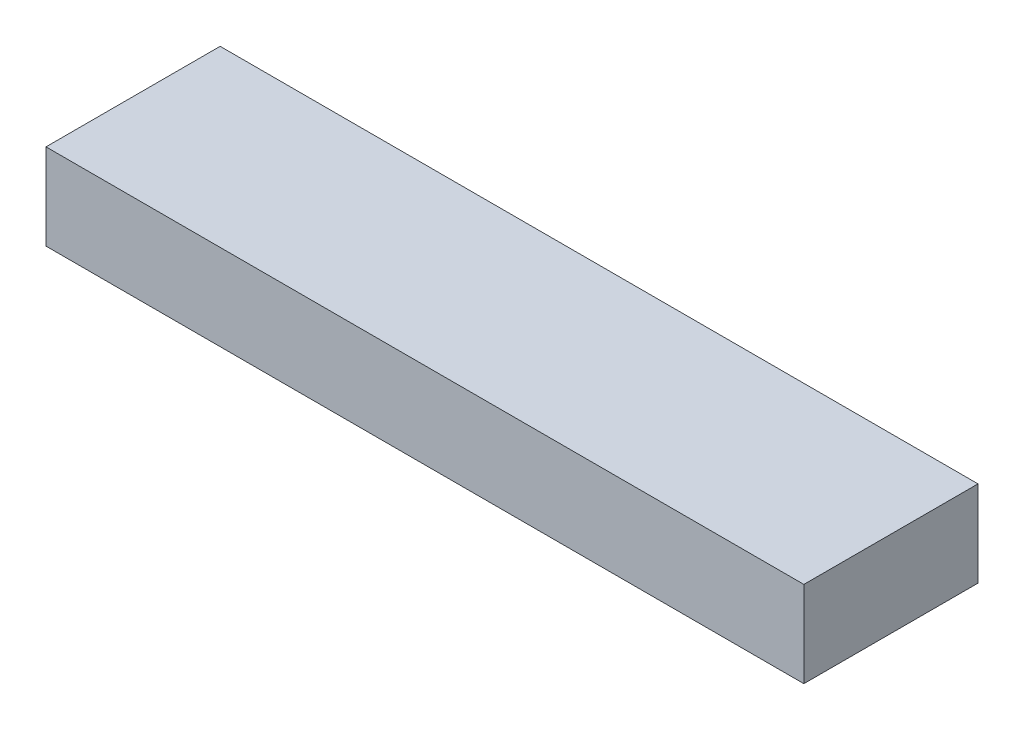
ISO-10303-21;
HEADER;
FILE_DESCRIPTION(('STEP AP214'),'2;1');
FILE_NAME('part.step','',(''),(''),'','','');
FILE_SCHEMA(('AUTOMOTIVE_DESIGN { 1 0 10303 214 1 1 1 1 }'));
ENDSEC;
DATA;
#1=APPLICATION_CONTEXT('core data for automotive mechanical design processes');
#2=APPLICATION_PROTOCOL_DEFINITION('international standard','automotive_design',2000,#1);
#3=PRODUCT_CONTEXT('',#1,'mechanical');
#4=PRODUCT('Part','Part','',(#3));
#5=PRODUCT_RELATED_PRODUCT_CATEGORY('part','',(#4));
#6=PRODUCT_DEFINITION_FORMATION('','',#4);
#7=PRODUCT_DEFINITION_CONTEXT('part definition',#1,'design');
#8=PRODUCT_DEFINITION('design','',#6,#7);
#9=PRODUCT_DEFINITION_SHAPE('','',#8);
#10=(LENGTH_UNIT() NAMED_UNIT(*) SI_UNIT(.MILLI.,.METRE.));
#11=(NAMED_UNIT(*) PLANE_ANGLE_UNIT() SI_UNIT($,.RADIAN.));
#12=(NAMED_UNIT(*) SI_UNIT($,.STERADIAN.) SOLID_ANGLE_UNIT());
#13=UNCERTAINTY_MEASURE_WITH_UNIT(LENGTH_MEASURE(1.E-05),#10,'distance_accuracy_value','');
#14=(GEOMETRIC_REPRESENTATION_CONTEXT(3) GLOBAL_UNCERTAINTY_ASSIGNED_CONTEXT((#13)) GLOBAL_UNIT_ASSIGNED_CONTEXT((#10,
#11,#12)) REPRESENTATION_CONTEXT('',''));
#15=CARTESIAN_POINT('',(0.,0.,0.));
#16=DIRECTION('',(0.,0.,1.));
#17=DIRECTION('',(1.,0.,0.));
#18=AXIS2_PLACEMENT_3D('',#15,#16,#17);
#19=CARTESIAN_POINT('',(0.,0.,0.));
#20=DIRECTION('',(0.,1.,0.));
#21=DIRECTION('',(0.,0.,1.));
#22=AXIS2_PLACEMENT_3D('',#19,#20,#21);
#23=PLANE('',#22);
#24=CARTESIAN_POINT('',(859.436709010091,6.51824651149789E-13,-93.3450000001667));
#25=DIRECTION('',(0.,-1.,0.));
#26=DIRECTION('',(0.,0.,-1.));
#27=AXIS2_PLACEMENT_3D('',#24,#25,#26);
#28=CIRCLE('',#27,3.17500000000008);
#29=CARTESIAN_POINT('',(859.436709010091,6.73995557651443E-13,-96.5200000001668));
#30=VERTEX_POINT('',#29);
#31=EDGE_CURVE('E371',#30,#30,#28,.T.);
#32=ORIENTED_EDGE('',*,*,#31,.F.);
#33=EDGE_LOOP('',(#32));
#34=FACE_BOUND('',#33,.T.);
#35=CARTESIAN_POINT('',(65.6867090100912,5.94180294244323E-13,-85.0899999999998));
#36=DIRECTION('',(0.,-1.,0.));
#37=DIRECTION('',(0.,0.,-1.));
#38=AXIS2_PLACEMENT_3D('',#35,#36,#37);
#39=CIRCLE('',#38,3.175);
#40=CARTESIAN_POINT('',(65.6867090100912,6.16351200745977E-13,-88.2649999999998));
#41=VERTEX_POINT('',#40);
#42=EDGE_CURVE('E363',#41,#41,#39,.T.);
#43=ORIENTED_EDGE('',*,*,#42,.F.);
#44=EDGE_LOOP('',(#43));
#45=FACE_BOUND('',#44,.T.);
#46=CARTESIAN_POINT('',(211.736709010091,4.32776094912283E-13,-61.9759999999998));
#47=DIRECTION('',(0.,-1.,0.));
#48=DIRECTION('',(0.,0.,-1.));
#49=AXIS2_PLACEMENT_3D('',#46,#47,#48);
#50=CIRCLE('',#49,3.17499999999997);
#51=CARTESIAN_POINT('',(211.736709010091,4.54947001413937E-13,-65.1509999999998));
#52=VERTEX_POINT('',#51);
#53=EDGE_CURVE('E356',#52,#52,#50,.T.);
#54=ORIENTED_EDGE('',*,*,#53,.F.);
#55=EDGE_LOOP('',(#54));
#56=FACE_BOUND('',#55,.T.);
#57=CARTESIAN_POINT('',(630.836709010091,6.51824651148623E-13,-93.3449999999998));
#58=DIRECTION('',(0.,-1.,0.));
#59=DIRECTION('',(0.,0.,-1.));
#60=AXIS2_PLACEMENT_3D('',#57,#58,#59);
#61=CIRCLE('',#60,3.17499999999997);
#62=CARTESIAN_POINT('',(630.836709010091,6.73995557650277E-13,-96.5199999999998));
#63=VERTEX_POINT('',#62);
#64=EDGE_CURVE('E249',#63,#63,#61,.T.);
#65=ORIENTED_EDGE('',*,*,#64,.F.);
#66=EDGE_LOOP('',(#65));
#67=FACE_BOUND('',#66,.T.);
#68=CARTESIAN_POINT('',(402.236709010091,5.94180294244323E-13,-85.0899999999998));
#69=DIRECTION('',(0.,-1.,0.));
#70=DIRECTION('',(0.,0.,-1.));
#71=AXIS2_PLACEMENT_3D('',#68,#69,#70);
#72=CIRCLE('',#71,3.17499999999997);
#73=CARTESIAN_POINT('',(402.236709010091,6.16351200745977E-13,-88.2649999999998));
#74=VERTEX_POINT('',#73);
#75=EDGE_CURVE('E248',#74,#74,#72,.T.);
#76=ORIENTED_EDGE('',*,*,#75,.F.);
#77=EDGE_LOOP('',(#76));
#78=FACE_BOUND('',#77,.T.);
#79=CARTESIAN_POINT('',(65.6867090100912,2.48314152818522E-13,-35.5599999999998));
#80=DIRECTION('',(0.,-1.,0.));
#81=DIRECTION('',(0.,0.,-1.));
#82=AXIS2_PLACEMENT_3D('',#79,#80,#81);
#83=CIRCLE('',#82,3.175);
#84=CARTESIAN_POINT('',(65.6867090100912,2.70485059320176E-13,-38.7349999999998));
#85=VERTEX_POINT('',#84);
#86=EDGE_CURVE('E338',#85,#85,#83,.T.);
#87=ORIENTED_EDGE('',*,*,#86,.F.);
#88=EDGE_LOOP('',(#87));
#89=FACE_BOUND('',#88,.T.);
#90=DIRECTION('',(0.,0.,1.));
#91=VECTOR('',#90,1.);
#92=CARTESIAN_POINT('',(21.2367090100912,7.18337370653585E-13,-102.87));
#93=LINE('',#92,#91);
#94=CARTESIAN_POINT('',(21.2367090100912,7.18337370653585E-13,-102.87));
#95=VERTEX_POINT('',#94);
#96=CARTESIAN_POINT('',(21.2367090100912,-7.18337370653585E-13,102.87));
#97=VERTEX_POINT('',#96);
#98=EDGE_CURVE('E168',#95,#97,#93,.T.);
#99=ORIENTED_EDGE('',*,*,#98,.F.);
#100=DIRECTION('',(-1.,0.,0.));
#101=VECTOR('',#100,1.);
#102=CARTESIAN_POINT('',(21.2367090100912,7.18337370653585E-13,-102.87));
#103=LINE('',#102,#101);
#104=CARTESIAN_POINT('',(916.641442589869,7.18337370653585E-13,-102.87));
#105=VERTEX_POINT('',#104);
#106=EDGE_CURVE('E174',#105,#95,#103,.T.);
#107=ORIENTED_EDGE('',*,*,#106,.F.);
#108=DIRECTION('',(0.,0.,-1.));
#109=VECTOR('',#108,1.);
#110=CARTESIAN_POINT('',(916.641442589869,7.18337370653585E-13,-102.87));
#111=LINE('',#110,#109);
#112=CARTESIAN_POINT('',(916.641442589869,-7.18337370653585E-13,102.87));
#113=VERTEX_POINT('',#112);
#114=EDGE_CURVE('E190',#113,#105,#111,.T.);
#115=ORIENTED_EDGE('',*,*,#114,.F.);
#116=DIRECTION('',(1.,0.,0.));
#117=VECTOR('',#116,1.);
#118=CARTESIAN_POINT('',(21.2367090100912,-7.18337370653585E-13,102.87));
#119=LINE('',#118,#117);
#120=EDGE_CURVE('E187',#97,#113,#119,.T.);
#121=ORIENTED_EDGE('',*,*,#120,.F.);
#122=EDGE_LOOP('',(#99,#107,#115,#121));
#123=FACE_BOUND('',#122,.T.);
#124=DIRECTION('',(-0.173648177666927,0.,-0.984807753012209));
#125=VECTOR('',#124,1.);
#126=CARTESIAN_POINT('',(889.161715066886,0.,-83.8199999999998));
#127=LINE('',#126,#125);
#128=CARTESIAN_POINT('',(903.94144258987,0.,0.));
#129=VERTEX_POINT('',#128);
#130=CARTESIAN_POINT('',(889.624338353712,0.,-81.1963329640923));
#131=VERTEX_POINT('',#130);
#132=EDGE_CURVE('E334',#129,#131,#127,.T.);
#133=ORIENTED_EDGE('',*,*,#132,.T.);
#134=CARTESIAN_POINT('',(886.497573737899,5.63141025142008E-13,-80.6449999999998));
#135=DIRECTION('',(0.,1.,0.));
#136=DIRECTION('',(0.,0.,1.));
#137=AXIS2_PLACEMENT_3D('',#134,#135,#136);
#138=CIRCLE('',#137,3.175);
#139=CARTESIAN_POINT('',(886.497573737899,0.,-83.8199999999998));
#140=VERTEX_POINT('',#139);
#141=EDGE_CURVE('E229',#131,#140,#138,.T.);
#142=ORIENTED_EDGE('',*,*,#141,.T.);
#143=DIRECTION('',(-1.,0.,0.));
#144=VECTOR('',#143,1.);
#145=CARTESIAN_POINT('',(838.361715066886,0.,-83.8199999999998));
#146=LINE('',#145,#144);
#147=CARTESIAN_POINT('',(838.361715170059,5.95576921116486E-13,-83.8200000003336));
#148=VERTEX_POINT('',#147);
#149=EDGE_CURVE('E328',#140,#148,#146,.T.);
#150=ORIENTED_EDGE('',*,*,#149,.T.);
#151=CARTESIAN_POINT('',(838.361715170059,0.,-83.8200000003336));
#152=CARTESIAN_POINT('',(835.937585303674,0.,-83.820000000392));
#153=CARTESIAN_POINT('',(831.089402446433,0.,-83.787712375967));
#154=CARTESIAN_POINT('',(821.393522916007,0.,-83.674273900401));
#155=CARTESIAN_POINT('',(808.219629904705,0.,-83.4260242466517));
#156=CARTESIAN_POINT('',(793.992125907232,0.,-83.0819921091471));
#157=CARTESIAN_POINT('',(778.711441944998,0.,-82.6371517002505));
#158=CARTESIAN_POINT('',(764.800431333268,0.,-82.1806537664532));
#159=CARTESIAN_POINT('',(740.458993876935,0.,-81.2992778827526));
#160=CARTESIAN_POINT('',(705.693597746673,0.,-79.8275368317898));
#161=CARTESIAN_POINT('',(660.514345838968,0.,-77.568482026395));
#162=CARTESIAN_POINT('',(611.88282130093,0.,-74.7141937177408));
#163=CARTESIAN_POINT('',(570.215765491016,0.,-71.9953649910672));
#164=CARTESIAN_POINT('',(535.505139038152,0.,-69.5554199149989));
#165=CARTESIAN_POINT('',(507.744043491357,0.,-67.5008803598799));
#166=CARTESIAN_POINT('',(479.990655319002,0.,-65.3447036088392));
#167=CARTESIAN_POINT('',(452.245340769262,0.,-63.0870378092517));
#168=CARTESIAN_POINT('',(424.508528663568,0.,-60.727153230238));
#169=CARTESIAN_POINT('',(396.780744260161,0.,-58.2634924129543));
#170=CARTESIAN_POINT('',(369.062594864741,0.,-55.6935640262053));
#171=CARTESIAN_POINT('',(344.818319430365,0.,-53.3488329553777));
#172=CARTESIAN_POINT('',(324.044555273653,0.,-51.2675185606868));
#173=CARTESIAN_POINT('',(303.276895107049,0.,-49.1266787379635));
#174=CARTESIAN_POINT('',(282.515559062119,0.,-46.9245341325058));
#175=CARTESIAN_POINT('',(258.304205532929,0.,-44.2616645437663));
#176=CARTESIAN_POINT('',(234.106301617241,0.,-41.477276738633));
#177=CARTESIAN_POINT('',(213.376725127657,0.,-38.9955275614719));
#178=CARTESIAN_POINT('',(196.110093107947,0.,-36.8582463991118));
#179=CARTESIAN_POINT('',(182.303059593679,0.,-35.1044670692912));
#180=CARTESIAN_POINT('',(168.500584619527,0.,-33.303205201259));
#181=CARTESIAN_POINT('',(154.707618563215,0.,-31.4515775107746));
#182=CARTESIAN_POINT('',(142.640819969063,0.,-29.7821189197596));
#183=CARTESIAN_POINT('',(132.31024774893,0.,-28.314515818514));
#184=CARTESIAN_POINT('',(121.972557788893,0.,-26.8117401790688));
#185=CARTESIAN_POINT('',(111.661947142871,0.,-25.2783076627595));
#186=CARTESIAN_POINT('',(99.5962176590184,0.,-23.4252445893486));
#187=CARTESIAN_POINT('',(87.5631367053617,0.,-21.5012303620064));
#188=CARTESIAN_POINT('',(77.1048053574477,0.,-19.7592990209326));
#189=CARTESIAN_POINT('',(68.4688655459128,0.,-18.2716304939461));
#190=CARTESIAN_POINT('',(62.1462378587412,0.,-17.1469713230858));
#191=CARTESIAN_POINT('',(57.1241195432014,0.,-16.2329318282769));
#192=CARTESIAN_POINT('',(53.2513302070043,0.,-15.5085368277448));
#193=CARTESIAN_POINT('',(51.6252711934928,0.,-15.2012908806096));
#194=CARTESIAN_POINT('',(50.8000001015149,0.,-15.044272799801));
#195=B_SPLINE_CURVE_WITH_KNOTS('',4,(#151,#152,#153,#154,#155,#156,#157,#158,#159,#160,#161,
#162,#163,#164,#165,#166,#167,#168,#169,#170,#171,#172,#173,#174,#175,#176,#177,#178,#179,#180,
#181,#182,#183,#184,#185,#186,#187,#188,#189,#190,#191,#192,#193,#194),.UNSPECIFIED.,.F.,.F.,(5,
1,1,1,1,1,1,1,1,1,1,1,1,1,1,1,1,1,1,1,1,1,1,1,1,1,1,1,1,1,1,1,1,1,1,1,1,1,1,1,5),
(0.0618008052229242,0.0732988350564007,0.084796865012218,0.107792924923853,0.12429735410404,
0.140801783284226,0.157306212464413,0.1738106416446,0.239828357358775,0.305846074067452,
0.371863790018574,0.404872648233403,0.437881506448232,0.470890364463846,0.50389922247946,
0.536908080831819,0.569916939184178,0.602925796904045,0.635934654623911,0.668943512986185,
0.685447942167322,0.701952371348459,0.734961229615615,0.767970087882771,0.80097894525773,
0.81748337394521,0.83398780263269,0.850492231282389,0.866996659932089,0.883501088581789,
0.900005517231489,0.90825773161075,0.91650994599001,0.933014374748531,0.949518803507052,
0.966023232265574,0.974517424134734,0.983011616003895,0.991505807873055,0.995752903807636,
0.999999999877659),.UNSPECIFIED.);
#196=CARTESIAN_POINT('',(52.9592168233622,0.,-15.4524990464043));
#197=VERTEX_POINT('',#196);
#198=EDGE_CURVE('E321',#148,#197,#195,.T.);
#199=ORIENTED_EDGE('',*,*,#198,.T.);
#200=CARTESIAN_POINT('',(53.5457587088768,0.,-12.3321475250951));
#201=DIRECTION('',(0.,1.,0.));
#202=DIRECTION('',(0.,0.,1.));
#203=AXIS2_PLACEMENT_3D('',#200,#201,#202);
#204=CIRCLE('',#203,3.175);
#205=CARTESIAN_POINT('',(50.4189940275935,0.,-12.8834805360154));
#206=VERTEX_POINT('',#205);
#207=EDGE_CURVE('E47',#197,#206,#204,.T.);
#208=ORIENTED_EDGE('',*,*,#207,.T.);
#209=DIRECTION('',(-0.173648177666934,0.,0.984807753012207));
#210=VECTOR('',#209,1.);
#211=CARTESIAN_POINT('',(49.2669651311604,0.,-6.35));
#212=LINE('',#211,#210);
#213=CARTESIAN_POINT('',(49.2669651311604,0.,-6.35));
#214=VERTEX_POINT('',#213);
#215=EDGE_CURVE('E318',#206,#214,#212,.T.);
#216=ORIENTED_EDGE('',*,*,#215,.T.);
#217=DIRECTION('',(-1.,0.,0.));
#218=VECTOR('',#217,1.);
#219=CARTESIAN_POINT('',(49.2669651311604,0.,-6.35));
#220=LINE('',#219,#218);
#221=CARTESIAN_POINT('',(38.6884323065541,0.,-6.35));
#222=VERTEX_POINT('',#221);
#223=EDGE_CURVE('E147',#214,#222,#220,.T.);
#224=ORIENTED_EDGE('',*,*,#223,.T.);
#225=CARTESIAN_POINT('',(38.6884323065541,0.,-3.175));
#226=DIRECTION('',(0.,1.,0.));
#227=DIRECTION('',(0.,0.,1.));
#228=AXIS2_PLACEMENT_3D('',#225,#226,#227);
#229=CIRCLE('',#228,3.175);
#230=CARTESIAN_POINT('',(35.7551147908308,0.,-4.39001989775917));
#231=VERTEX_POINT('',#230);
#232=EDGE_CURVE('E235',#222,#231,#229,.T.);
#233=ORIENTED_EDGE('',*,*,#232,.T.);
#234=DIRECTION('',(-0.382683432365093,0.,0.923879532511286));
#235=VECTOR('',#234,1.);
#236=CARTESIAN_POINT('',(36.5669651311604,0.,-6.35));
#237=LINE('',#236,#235);
#238=CARTESIAN_POINT('',(33.9367090100912,0.,0.));
#239=VERTEX_POINT('',#238);
#240=EDGE_CURVE('E242',#231,#239,#237,.T.);
#241=ORIENTED_EDGE('',*,*,#240,.T.);
#242=DIRECTION('',(-0.382683432365093,0.,-0.923879532511286));
#243=VECTOR('',#242,1.);
#244=CARTESIAN_POINT('',(36.5669651311604,0.,6.35));
#245=LINE('',#244,#243);
#246=CARTESIAN_POINT('',(35.7551147908308,0.,4.39001989775917));
#247=VERTEX_POINT('',#246);
#248=EDGE_CURVE('E150',#247,#239,#245,.T.);
#249=ORIENTED_EDGE('',*,*,#248,.F.);
#250=CARTESIAN_POINT('',(38.6884323065541,0.,3.175));
#251=DIRECTION('',(0.,1.,0.));
#252=DIRECTION('',(0.,0.,1.));
#253=AXIS2_PLACEMENT_3D('',#250,#251,#252);
#254=CIRCLE('',#253,3.175);
#255=CARTESIAN_POINT('',(38.6884323065541,0.,6.35));
#256=VERTEX_POINT('',#255);
#257=EDGE_CURVE('E155',#247,#256,#254,.T.);
#258=ORIENTED_EDGE('',*,*,#257,.T.);
#259=DIRECTION('',(-1.,0.,0.));
#260=VECTOR('',#259,1.);
#261=CARTESIAN_POINT('',(49.2669651311604,0.,6.35));
#262=LINE('',#261,#260);
#263=CARTESIAN_POINT('',(49.2669651311604,0.,6.35));
#264=VERTEX_POINT('',#263);
#265=EDGE_CURVE('E137',#264,#256,#262,.T.);
#266=ORIENTED_EDGE('',*,*,#265,.F.);
#267=DIRECTION('',(-0.173648177666934,0.,-0.984807753012207));
#268=VECTOR('',#267,1.);
#269=CARTESIAN_POINT('',(49.2669651311604,0.,6.35));
#270=LINE('',#269,#268);
#271=CARTESIAN_POINT('',(50.4189940275935,0.,12.8834805360154));
#272=VERTEX_POINT('',#271);
#273=EDGE_CURVE('E130',#272,#264,#270,.T.);
#274=ORIENTED_EDGE('',*,*,#273,.F.);
#275=CARTESIAN_POINT('',(53.5457587088768,0.,12.3321475250951));
#276=DIRECTION('',(0.,1.,0.));
#277=DIRECTION('',(0.,0.,1.));
#278=AXIS2_PLACEMENT_3D('',#275,#276,#277);
#279=CIRCLE('',#278,3.175);
#280=CARTESIAN_POINT('',(52.9592168233622,-1.07904224118024E-13,15.4524990464043));
#281=VERTEX_POINT('',#280);
#282=EDGE_CURVE('E11',#272,#281,#279,.T.);
#283=ORIENTED_EDGE('',*,*,#282,.T.);
#284=CARTESIAN_POINT('',(838.361715170059,-5.85311931645992E-13,83.8200000003336));
#285=CARTESIAN_POINT('',(835.937585303674,-5.853119316464E-13,83.820000000392));
#286=CARTESIAN_POINT('',(831.089402446433,-5.85086468370089E-13,83.787712375967));
#287=CARTESIAN_POINT('',(821.393522916007,-5.84294331728998E-13,83.674273900401));
#288=CARTESIAN_POINT('',(808.219629904705,-5.82560813662118E-13,83.4260242466517));
#289=CARTESIAN_POINT('',(793.992125907232,-5.80158450085999E-13,83.0819921091471));
#290=CARTESIAN_POINT('',(778.711441944998,-5.77052146113148E-13,82.6371517002505));
#291=CARTESIAN_POINT('',(764.800431333268,-5.73864438079E-13,82.1806537664532));
#292=CARTESIAN_POINT('',(740.458993876935,-5.67709823178106E-13,81.2992778827526));
#293=CARTESIAN_POINT('',(705.693597746673,-5.57432710348014E-13,79.8275368317898));
#294=CARTESIAN_POINT('',(660.514345838968,-5.41657814955094E-13,77.568482026395));
#295=CARTESIAN_POINT('',(611.88282130093,-5.21726426224406E-13,74.7141937177408));
#296=CARTESIAN_POINT('',(570.215765491016,-5.02740946699022E-13,71.9953649910672));
#297=CARTESIAN_POINT('',(535.505139038152,-4.85702901297233E-13,69.5554199149989));
#298=CARTESIAN_POINT('',(507.744043491357,-4.71356128264007E-13,67.5008803598799));
#299=CARTESIAN_POINT('',(479.990655319002,-4.56299626484995E-13,65.3447036088392));
#300=CARTESIAN_POINT('',(452.245340769262,-4.40534430467787E-13,63.0870378092517));
#301=CARTESIAN_POINT('',(424.508528663568,-4.24055444528887E-13,60.727153230238));
#302=CARTESIAN_POINT('',(396.780744260161,-4.06851792991317E-13,58.2634924129543));
#303=CARTESIAN_POINT('',(369.062594864741,-3.88906078982322E-13,55.6935640262053));
#304=CARTESIAN_POINT('',(344.818319430365,-3.72532909425521E-13,53.3488329553777));
#305=CARTESIAN_POINT('',(324.044555273653,-3.57999168686864E-13,51.2675185606868));
#306=CARTESIAN_POINT('',(303.276895107049,-3.43049764105882E-13,49.1266787379635));
#307=CARTESIAN_POINT('',(282.515559062119,-3.27672270515103E-13,46.9245341325058));
#308=CARTESIAN_POINT('',(258.304205532929,-3.09077551561389E-13,44.2616645437663));
#309=CARTESIAN_POINT('',(234.106301617241,-2.89634275437939E-13,41.477276738633));
#310=CARTESIAN_POINT('',(213.376725127657,-2.72304313558444E-13,38.9955275614719));
#311=CARTESIAN_POINT('',(196.110093107947,-2.57379758969962E-13,36.8582463991118));
#312=CARTESIAN_POINT('',(182.303059593679,-2.45133183364927E-13,35.1044670692912));
#313=CARTESIAN_POINT('',(168.500584619527,-2.32555038967719E-13,33.303205201259));
#314=CARTESIAN_POINT('',(154.707618563215,-2.19625191912096E-13,31.4515775107746));
#315=CARTESIAN_POINT('',(142.640819969063,-2.07967424879095E-13,29.7821189197596));
#316=CARTESIAN_POINT('',(132.31024774893,-1.9771920719744E-13,28.314515818514));
#317=CARTESIAN_POINT('',(121.972557788893,-1.87225380994259E-13,26.8117401790688));
#318=CARTESIAN_POINT('',(111.661947142871,-1.7651747896412E-13,25.2783076627595));
#319=CARTESIAN_POINT('',(99.5962176590184,-1.63577608683093E-13,23.4252445893486));
#320=CARTESIAN_POINT('',(87.5631367053617,-1.50142289142225E-13,21.5012303620064));
#321=CARTESIAN_POINT('',(77.1048053574477,-1.37978447600415E-13,19.7592990209326));
#322=CARTESIAN_POINT('',(68.4688655459128,-1.275901137997E-13,18.2716304939461));
#323=CARTESIAN_POINT('',(62.1462378587412,-1.19736660784465E-13,17.1469713230858));
#324=CARTESIAN_POINT('',(57.1241195432014,-1.13353957106283E-13,16.2329318282769));
#325=CARTESIAN_POINT('',(53.2513302070043,-1.08295533853665E-13,15.5085368277448));
#326=CARTESIAN_POINT('',(51.6252711934928,-1.06150046871949E-13,15.2012908806096));
#327=CARTESIAN_POINT('',(50.8000001015149,-1.05053595473941E-13,15.044272799801));
#328=B_SPLINE_CURVE_WITH_KNOTS('',4,(#284,#285,#286,#287,#288,#289,#290,#291,#292,#293,#294,
#295,#296,#297,#298,#299,#300,#301,#302,#303,#304,#305,#306,#307,#308,#309,#310,#311,#312,#313,
#314,#315,#316,#317,#318,#319,#320,#321,#322,#323,#324,#325,#326,#327),.UNSPECIFIED.,.F.,.F.,(5,
1,1,1,1,1,1,1,1,1,1,1,1,1,1,1,1,1,1,1,1,1,1,1,1,1,1,1,1,1,1,1,1,1,1,1,1,1,1,1,5),
(0.0618008052229242,0.0732988350564007,0.084796865012218,0.107792924923853,0.12429735410404,
0.140801783284226,0.157306212464413,0.1738106416446,0.239828357358775,0.305846074067452,
0.371863790018574,0.404872648233403,0.437881506448232,0.470890364463846,0.50389922247946,
0.536908080831819,0.569916939184178,0.602925796904045,0.635934654623911,0.668943512986185,
0.685447942167322,0.701952371348459,0.734961229615615,0.767970087882771,0.80097894525773,
0.81748337394521,0.83398780263269,0.850492231282389,0.866996659932089,0.883501088581789,
0.900005517231489,0.90825773161075,0.91650994599001,0.933014374748531,0.949518803507052,
0.966023232265574,0.974517424134734,0.983011616003895,0.991505807873055,0.995752903807636,
0.999999999877659),.UNSPECIFIED.);
#329=CARTESIAN_POINT('',(838.361715170059,-5.85311931645992E-13,83.8200000003336));
#330=VERTEX_POINT('',#329);
#331=EDGE_CURVE('E138',#330,#281,#328,.T.);
#332=ORIENTED_EDGE('',*,*,#331,.F.);
#333=DIRECTION('',(-1.,0.,0.));
#334=VECTOR('',#333,1.);
#335=CARTESIAN_POINT('',(838.361715066886,-5.85311931643662E-13,83.8199999999998));
#336=LINE('',#335,#334);
#337=CARTESIAN_POINT('',(886.497573737899,-5.85311931643662E-13,83.8199999999998));
#338=VERTEX_POINT('',#337);
#339=EDGE_CURVE('E252',#338,#330,#336,.T.);
#340=ORIENTED_EDGE('',*,*,#339,.F.);
#341=CARTESIAN_POINT('',(886.497573737899,-5.63141025142008E-13,80.6449999999998));
#342=DIRECTION('',(0.,1.,0.));
#343=DIRECTION('',(0.,0.,1.));
#344=AXIS2_PLACEMENT_3D('',#341,#342,#343);
#345=CIRCLE('',#344,3.175);
#346=CARTESIAN_POINT('',(889.624338353712,-5.66990962653244E-13,81.1963329640923));
#347=VERTEX_POINT('',#346);
#348=EDGE_CURVE('E232',#338,#347,#345,.T.);
#349=ORIENTED_EDGE('',*,*,#348,.T.);
#350=DIRECTION('',(-0.173648177666927,0.,0.984807753012209));
#351=VECTOR('',#350,1.);
#352=CARTESIAN_POINT('',(889.161715066886,-5.85311931643662E-13,83.8199999999998));
#353=LINE('',#352,#351);
#354=EDGE_CURVE('E243',#129,#347,#353,.T.);
#355=ORIENTED_EDGE('',*,*,#354,.F.);
#356=EDGE_LOOP('',(#133,#142,#150,#199,#208,#216,#224,#233,#241,#249,#258,#266,#274,#283,#332,
#340,#349,#355));
#357=FACE_BOUND('',#356,.T.);
#358=ADVANCED_FACE('F38',(#34,#45,#56,#67,#78,#89,#123,#357),#23,.F.);
#359=CARTESIAN_POINT('',(21.2367090100912,101.600000000001,-102.869999999999));
#360=DIRECTION('',(1.,0.,0.));
#361=DIRECTION('',(0.,0.,-1.));
#362=AXIS2_PLACEMENT_3D('',#359,#360,#361);
#363=PLANE('',#362);
#364=ORIENTED_EDGE('',*,*,#98,.T.);
#365=DIRECTION('',(0.,-1.,0.));
#366=VECTOR('',#365,1.);
#367=CARTESIAN_POINT('',(21.2367090100912,101.599999999999,102.870000000001));
#368=LINE('',#367,#366);
#369=CARTESIAN_POINT('',(21.2367090100912,101.599999999999,102.870000000001));
#370=VERTEX_POINT('',#369);
#371=EDGE_CURVE('E206',#370,#97,#368,.T.);
#372=ORIENTED_EDGE('',*,*,#371,.F.);
#373=DIRECTION('',(0.,0.,1.));
#374=VECTOR('',#373,1.);
#375=CARTESIAN_POINT('',(21.2367090100912,101.600000000001,-102.869999999999));
#376=LINE('',#375,#374);
#377=CARTESIAN_POINT('',(21.2367090100912,101.600000000001,-102.869999999999));
#378=VERTEX_POINT('',#377);
#379=EDGE_CURVE('E169',#378,#370,#376,.T.);
#380=ORIENTED_EDGE('',*,*,#379,.F.);
#381=DIRECTION('',(0.,-1.,0.));
#382=VECTOR('',#381,1.);
#383=CARTESIAN_POINT('',(21.2367090100912,101.600000000001,-102.869999999999));
#384=LINE('',#383,#382);
#385=EDGE_CURVE('E183',#378,#95,#384,.T.);
#386=ORIENTED_EDGE('',*,*,#385,.T.);
#387=EDGE_LOOP('',(#364,#372,#380,#386));
#388=FACE_BOUND('',#387,.T.);
#389=ADVANCED_FACE('F288',(#388),#363,.F.);
#390=CARTESIAN_POINT('',(21.2367090100912,101.599999999999,102.870000000001));
#391=DIRECTION('',(0.,0.,-1.));
#392=DIRECTION('',(0.,1.,0.));
#393=AXIS2_PLACEMENT_3D('',#390,#391,#392);
#394=PLANE('',#393);
#395=ORIENTED_EDGE('',*,*,#120,.T.);
#396=DIRECTION('',(0.,-1.,0.));
#397=VECTOR('',#396,1.);
#398=CARTESIAN_POINT('',(916.641442589869,101.599999999999,102.870000000001));
#399=LINE('',#398,#397);
#400=CARTESIAN_POINT('',(916.641442589869,101.599999999999,102.870000000001));
#401=VERTEX_POINT('',#400);
#402=EDGE_CURVE('E202',#401,#113,#399,.T.);
#403=ORIENTED_EDGE('',*,*,#402,.F.);
#404=DIRECTION('',(1.,0.,0.));
#405=VECTOR('',#404,1.);
#406=CARTESIAN_POINT('',(21.2367090100912,101.599999999999,102.870000000001));
#407=LINE('',#406,#405);
#408=EDGE_CURVE('E173',#370,#401,#407,.T.);
#409=ORIENTED_EDGE('',*,*,#408,.F.);
#410=ORIENTED_EDGE('',*,*,#371,.T.);
#411=EDGE_LOOP('',(#395,#403,#409,#410));
#412=FACE_BOUND('',#411,.T.);
#413=ADVANCED_FACE('F296',(#412),#394,.F.);
#414=CARTESIAN_POINT('',(916.641442589869,101.600000000001,-102.869999999999));
#415=DIRECTION('',(-1.,0.,0.));
#416=DIRECTION('',(0.,0.,1.));
#417=AXIS2_PLACEMENT_3D('',#414,#415,#416);
#418=PLANE('',#417);
#419=ORIENTED_EDGE('',*,*,#114,.T.);
#420=DIRECTION('',(0.,-1.,0.));
#421=VECTOR('',#420,1.);
#422=CARTESIAN_POINT('',(916.641442589869,101.600000000001,-102.869999999999));
#423=LINE('',#422,#421);
#424=CARTESIAN_POINT('',(916.641442589869,101.600000000001,-102.869999999999));
#425=VERTEX_POINT('',#424);
#426=EDGE_CURVE('E198',#425,#105,#423,.T.);
#427=ORIENTED_EDGE('',*,*,#426,.F.);
#428=DIRECTION('',(0.,0.,-1.));
#429=VECTOR('',#428,1.);
#430=CARTESIAN_POINT('',(916.641442589869,101.600000000001,-102.869999999999));
#431=LINE('',#430,#429);
#432=EDGE_CURVE('E177',#401,#425,#431,.T.);
#433=ORIENTED_EDGE('',*,*,#432,.F.);
#434=ORIENTED_EDGE('',*,*,#402,.T.);
#435=EDGE_LOOP('',(#419,#427,#433,#434));
#436=FACE_BOUND('',#435,.T.);
#437=ADVANCED_FACE('F292',(#436),#418,.F.);
#438=CARTESIAN_POINT('',(21.2367090100912,101.600000000001,-102.869999999999));
#439=DIRECTION('',(0.,0.,1.));
#440=DIRECTION('',(0.,-1.,0.));
#441=AXIS2_PLACEMENT_3D('',#438,#439,#440);
#442=PLANE('',#441);
#443=ORIENTED_EDGE('',*,*,#106,.T.);
#444=ORIENTED_EDGE('',*,*,#385,.F.);
#445=DIRECTION('',(-1.,0.,0.));
#446=VECTOR('',#445,1.);
#447=CARTESIAN_POINT('',(21.2367090100912,101.600000000001,-102.869999999999));
#448=LINE('',#447,#446);
#449=EDGE_CURVE('E180',#425,#378,#448,.T.);
#450=ORIENTED_EDGE('',*,*,#449,.F.);
#451=ORIENTED_EDGE('',*,*,#426,.T.);
#452=EDGE_LOOP('',(#443,#444,#450,#451));
#453=FACE_BOUND('',#452,.T.);
#454=ADVANCED_FACE('F284',(#453),#442,.F.);
#455=CARTESIAN_POINT('',(0.,101.6,7.09469008052925E-13));
#456=DIRECTION('',(0.,1.,0.));
#457=DIRECTION('',(0.,0.,1.));
#458=AXIS2_PLACEMENT_3D('',#455,#456,#457);
#459=PLANE('',#458);
#460=ORIENTED_EDGE('',*,*,#379,.T.);
#461=ORIENTED_EDGE('',*,*,#408,.T.);
#462=ORIENTED_EDGE('',*,*,#432,.T.);
#463=ORIENTED_EDGE('',*,*,#449,.T.);
#464=EDGE_LOOP('',(#460,#461,#462,#463));
#465=FACE_BOUND('',#464,.T.);
#466=ADVANCED_FACE('F281',(#465),#459,.T.);
#467=CARTESIAN_POINT('',(903.94144258987,0.,0.));
#468=DIRECTION('',(-1.,0.,0.));
#469=DIRECTION('',(0.,0.,1.));
#470=AXIS2_PLACEMENT_3D('',#467,#468,#469);
#471=CONICAL_SURFACE('',#470,0.,1.39626340159547);
#472=ORIENTED_EDGE('',*,*,#354,.T.);
#473=CARTESIAN_POINT('',(889.624338353712,0.,0.));
#474=DIRECTION('',(-1.,0.,0.));
#475=DIRECTION('',(0.,0.,1.));
#476=AXIS2_PLACEMENT_3D('',#473,#474,#475);
#477=CIRCLE('',#476,81.1963329640923);
#478=EDGE_CURVE('E210',#347,#131,#477,.T.);
#479=ORIENTED_EDGE('',*,*,#478,.T.);
#480=ORIENTED_EDGE('',*,*,#132,.F.);
#481=EDGE_LOOP('',(#472,#479,#480));
#482=FACE_BOUND('',#481,.T.);
#483=ADVANCED_FACE('F277',(#482),#471,.F.);
#484=CARTESIAN_POINT('',(0.,0.,0.));
#485=DIRECTION('',(-1.,0.,0.));
#486=DIRECTION('',(0.,0.,1.));
#487=AXIS2_PLACEMENT_3D('',#484,#485,#486);
#488=CYLINDRICAL_SURFACE('',#487,83.8199999999998);
#489=ORIENTED_EDGE('',*,*,#149,.F.);
#490=CARTESIAN_POINT('',(886.497573737899,0.,0.));
#491=DIRECTION('',(-1.,0.,0.));
#492=DIRECTION('',(0.,0.,1.));
#493=AXIS2_PLACEMENT_3D('',#490,#491,#492);
#494=CIRCLE('',#493,83.8199999999998);
#495=EDGE_CURVE('E214',#140,#338,#494,.F.);
#496=ORIENTED_EDGE('',*,*,#495,.T.);
#497=ORIENTED_EDGE('',*,*,#339,.T.);
#498=CARTESIAN_POINT('',(838.361715066886,0.,0.));
#499=DIRECTION('',(-1.,0.,0.));
#500=DIRECTION('',(0.,0.,1.));
#501=AXIS2_PLACEMENT_3D('',#498,#499,#500);
#502=CIRCLE('',#501,83.8199999999998);
#503=EDGE_CURVE('E149',#330,#148,#502,.T.);
#504=ORIENTED_EDGE('',*,*,#503,.T.);
#505=EDGE_LOOP('',(#489,#496,#497,#504));
#506=FACE_BOUND('',#505,.T.);
#507=ADVANCED_FACE('F272',(#506),#488,.F.);
#508=CARTESIAN_POINT('',(0.,0.,0.));
#509=DIRECTION('',(-1.,0.,0.));
#510=AXIS1_PLACEMENT('',#508,#509);
#511=SURFACE_OF_REVOLUTION('',#328,#510);
#512=ORIENTED_EDGE('',*,*,#331,.T.);
#513=CARTESIAN_POINT('',(52.9592168233622,0.,0.));
#514=DIRECTION('',(-1.,0.,0.));
#515=DIRECTION('',(0.,0.,1.));
#516=AXIS2_PLACEMENT_3D('',#513,#514,#515);
#517=CIRCLE('',#516,15.4524990464043);
#518=EDGE_CURVE('E223',#281,#197,#517,.T.);
#519=ORIENTED_EDGE('',*,*,#518,.T.);
#520=ORIENTED_EDGE('',*,*,#198,.F.);
#521=ORIENTED_EDGE('',*,*,#503,.F.);
#522=EDGE_LOOP('',(#512,#519,#520,#521));
#523=FACE_BOUND('',#522,.T.);
#524=ADVANCED_FACE('F268',(#523),#511,.F.);
#525=CARTESIAN_POINT('',(50.8000001015149,0.,0.));
#526=DIRECTION('',(1.,0.,0.));
#527=DIRECTION('',(0.,0.,-1.));
#528=AXIS2_PLACEMENT_3D('',#525,#526,#527);
#529=CONICAL_SURFACE('',#528,15.044272799801,1.3962633906513);
#530=ORIENTED_EDGE('',*,*,#215,.F.);
#531=CARTESIAN_POINT('',(50.4189940990969,0.,0.));
#532=DIRECTION('',(1.,0.,0.));
#533=DIRECTION('',(0.,0.,-1.));
#534=AXIS2_PLACEMENT_3D('',#531,#532,#533);
#535=CIRCLE('',#534,12.8834805234074);
#536=EDGE_CURVE('E54',#206,#272,#535,.T.);
#537=ORIENTED_EDGE('',*,*,#536,.T.);
#538=ORIENTED_EDGE('',*,*,#273,.T.);
#539=CARTESIAN_POINT('',(49.2669651311604,0.,0.));
#540=DIRECTION('',(-1.,0.,0.));
#541=DIRECTION('',(0.,0.,1.));
#542=AXIS2_PLACEMENT_3D('',#539,#540,#541);
#543=CIRCLE('',#542,6.35);
#544=EDGE_CURVE('E133',#264,#214,#543,.T.);
#545=ORIENTED_EDGE('',*,*,#544,.T.);
#546=EDGE_LOOP('',(#530,#537,#538,#545));
#547=FACE_BOUND('',#546,.T.);
#548=ADVANCED_FACE('F132',(#547),#529,.F.);
#549=CARTESIAN_POINT('',(0.,0.,0.));
#550=DIRECTION('',(-1.,0.,0.));
#551=DIRECTION('',(0.,0.,1.));
#552=AXIS2_PLACEMENT_3D('',#549,#550,#551);
#553=CYLINDRICAL_SURFACE('',#552,6.35);
#554=ORIENTED_EDGE('',*,*,#265,.T.);
#555=CARTESIAN_POINT('',(38.6884323065541,0.,0.));
#556=DIRECTION('',(-1.,0.,0.));
#557=DIRECTION('',(0.,0.,1.));
#558=AXIS2_PLACEMENT_3D('',#555,#556,#557);
#559=CIRCLE('',#558,6.35);
#560=EDGE_CURVE('E217',#256,#222,#559,.T.);
#561=ORIENTED_EDGE('',*,*,#560,.T.);
#562=ORIENTED_EDGE('',*,*,#223,.F.);
#563=ORIENTED_EDGE('',*,*,#544,.F.);
#564=EDGE_LOOP('',(#554,#561,#562,#563));
#565=FACE_BOUND('',#564,.T.);
#566=ADVANCED_FACE('F143',(#565),#553,.F.);
#567=CARTESIAN_POINT('',(36.5669651311604,0.,0.));
#568=DIRECTION('',(1.,0.,0.));
#569=DIRECTION('',(0.,0.,-1.));
#570=AXIS2_PLACEMENT_3D('',#567,#568,#569);
#571=CONICAL_SURFACE('',#570,6.35,1.17809724509617);
#572=ORIENTED_EDGE('',*,*,#240,.F.);
#573=CARTESIAN_POINT('',(35.7551147908308,0.,0.));
#574=DIRECTION('',(1.,0.,0.));
#575=DIRECTION('',(0.,0.,-1.));
#576=AXIS2_PLACEMENT_3D('',#573,#574,#575);
#577=CIRCLE('',#576,4.39001989775917);
#578=EDGE_CURVE('E220',#231,#247,#577,.T.);
#579=ORIENTED_EDGE('',*,*,#578,.T.);
#580=ORIENTED_EDGE('',*,*,#248,.T.);
#581=EDGE_LOOP('',(#572,#579,#580));
#582=FACE_BOUND('',#581,.T.);
#583=ADVANCED_FACE('F307',(#582),#571,.F.);
#584=CARTESIAN_POINT('',(886.497573737899,0.,0.));
#585=DIRECTION('',(-1.,0.,0.));
#586=DIRECTION('',(0.,0.,1.));
#587=AXIS2_PLACEMENT_3D('',#584,#585,#586);
#588=TOROIDAL_SURFACE('',#587,80.6449999999998,3.175);
#589=ORIENTED_EDGE('',*,*,#348,.F.);
#590=ORIENTED_EDGE('',*,*,#495,.F.);
#591=ORIENTED_EDGE('',*,*,#141,.F.);
#592=ORIENTED_EDGE('',*,*,#478,.F.);
#593=EDGE_LOOP('',(#589,#590,#591,#592));
#594=FACE_BOUND('',#593,.T.);
#595=ADVANCED_FACE('F304',(#594),#588,.F.);
#596=CARTESIAN_POINT('',(38.6884323065541,0.,0.));
#597=DIRECTION('',(-1.,0.,0.));
#598=DIRECTION('',(0.,0.,1.));
#599=AXIS2_PLACEMENT_3D('',#596,#597,#598);
#600=DEGENERATE_TOROIDAL_SURFACE('',#599,3.175,3.175,.T.);
#601=ORIENTED_EDGE('',*,*,#257,.F.);
#602=ORIENTED_EDGE('',*,*,#578,.F.);
#603=ORIENTED_EDGE('',*,*,#232,.F.);
#604=ORIENTED_EDGE('',*,*,#560,.F.);
#605=EDGE_LOOP('',(#601,#602,#603,#604));
#606=FACE_BOUND('',#605,.T.);
#607=ADVANCED_FACE('F306',(#606),#600,.F.);
#608=CARTESIAN_POINT('',(53.5457587088768,0.,0.));
#609=DIRECTION('',(-1.,0.,0.));
#610=DIRECTION('',(0.,0.,1.));
#611=AXIS2_PLACEMENT_3D('',#608,#609,#610);
#612=TOROIDAL_SURFACE('',#611,12.3321475250951,3.175);
#613=ORIENTED_EDGE('',*,*,#282,.F.);
#614=ORIENTED_EDGE('',*,*,#536,.F.);
#615=ORIENTED_EDGE('',*,*,#207,.F.);
#616=ORIENTED_EDGE('',*,*,#518,.F.);
#617=EDGE_LOOP('',(#613,#614,#615,#616));
#618=FACE_BOUND('',#617,.T.);
#619=ADVANCED_FACE('F40',(#618),#612,.F.);
#620=CARTESIAN_POINT('',(65.6867090100912,12.7000000000002,-35.5599999999997));
#621=DIRECTION('',(0.,-1.,0.));
#622=DIRECTION('',(0.,0.,-1.));
#623=AXIS2_PLACEMENT_3D('',#620,#621,#622);
#624=CYLINDRICAL_SURFACE('',#623,3.175);
#625=CARTESIAN_POINT('',(65.6867090100912,12.7000000000002,-35.5599999999997));
#626=DIRECTION('',(0.,-1.,0.));
#627=DIRECTION('',(0.,0.,-1.));
#628=AXIS2_PLACEMENT_3D('',#625,#626,#627);
#629=CIRCLE('',#628,3.175);
#630=CARTESIAN_POINT('',(65.6867090100912,12.7000000000003,-38.7349999999997));
#631=VERTEX_POINT('',#630);
#632=EDGE_CURVE('E337',#631,#631,#629,.T.);
#633=ORIENTED_EDGE('',*,*,#632,.F.);
#634=EDGE_LOOP('',(#633));
#635=FACE_BOUND('',#634,.T.);
#636=ORIENTED_EDGE('',*,*,#86,.T.);
#637=EDGE_LOOP('',(#636));
#638=FACE_BOUND('',#637,.T.);
#639=ADVANCED_FACE('F314',(#635,#638),#624,.F.);
#640=CARTESIAN_POINT('',(65.6867090100912,12.7000000000002,-35.5599999999997));
#641=DIRECTION('',(0.,-1.,0.));
#642=DIRECTION('',(0.,0.,-1.));
#643=AXIS2_PLACEMENT_3D('',#640,#641,#642);
#644=PLANE('',#643);
#645=ORIENTED_EDGE('',*,*,#632,.T.);
#646=EDGE_LOOP('',(#645));
#647=FACE_BOUND('',#646,.T.);
#648=ADVANCED_FACE('F410',(#647),#644,.T.);
#649=CARTESIAN_POINT('',(402.236709010091,12.7000000000006,-85.0899999999997));
#650=DIRECTION('',(0.,-1.,0.));
#651=DIRECTION('',(0.,0.,-1.));
#652=AXIS2_PLACEMENT_3D('',#649,#650,#651);
#653=CYLINDRICAL_SURFACE('',#652,3.17499999999997);
#654=CARTESIAN_POINT('',(402.236709010091,12.7000000000006,-85.0899999999997));
#655=DIRECTION('',(0.,-1.,0.));
#656=DIRECTION('',(0.,0.,-1.));
#657=AXIS2_PLACEMENT_3D('',#654,#655,#656);
#658=CIRCLE('',#657,3.17499999999997);
#659=CARTESIAN_POINT('',(402.236709010091,12.7000000000006,-88.2649999999997));
#660=VERTEX_POINT('',#659);
#661=EDGE_CURVE('E342',#660,#660,#658,.T.);
#662=ORIENTED_EDGE('',*,*,#661,.F.);
#663=EDGE_LOOP('',(#662));
#664=FACE_BOUND('',#663,.T.);
#665=ORIENTED_EDGE('',*,*,#75,.T.);
#666=EDGE_LOOP('',(#665));
#667=FACE_BOUND('',#666,.T.);
#668=ADVANCED_FACE('F416',(#664,#667),#653,.F.);
#669=CARTESIAN_POINT('',(402.236709010091,12.7000000000006,-85.0899999999997));
#670=DIRECTION('',(0.,-1.,0.));
#671=DIRECTION('',(0.,0.,-1.));
#672=AXIS2_PLACEMENT_3D('',#669,#670,#671);
#673=PLANE('',#672);
#674=ORIENTED_EDGE('',*,*,#661,.T.);
#675=EDGE_LOOP('',(#674));
#676=FACE_BOUND('',#675,.T.);
#677=ADVANCED_FACE('F484',(#676),#673,.T.);
#678=CARTESIAN_POINT('',(630.836709010091,12.7000000000007,-93.3449999999997));
#679=DIRECTION('',(0.,-1.,0.));
#680=DIRECTION('',(0.,0.,-1.));
#681=AXIS2_PLACEMENT_3D('',#678,#679,#680);
#682=CYLINDRICAL_SURFACE('',#681,3.17499999999997);
#683=CARTESIAN_POINT('',(630.836709010091,12.7000000000007,-93.3449999999997));
#684=DIRECTION('',(0.,-1.,0.));
#685=DIRECTION('',(0.,0.,-1.));
#686=AXIS2_PLACEMENT_3D('',#683,#684,#685);
#687=CIRCLE('',#686,3.17499999999997);
#688=CARTESIAN_POINT('',(630.836709010091,12.7000000000007,-96.5199999999997));
#689=VERTEX_POINT('',#688);
#690=EDGE_CURVE('E246',#689,#689,#687,.T.);
#691=ORIENTED_EDGE('',*,*,#690,.F.);
#692=EDGE_LOOP('',(#691));
#693=FACE_BOUND('',#692,.T.);
#694=ORIENTED_EDGE('',*,*,#64,.T.);
#695=EDGE_LOOP('',(#694));
#696=FACE_BOUND('',#695,.T.);
#697=ADVANCED_FACE('F493',(#693,#696),#682,.F.);
#698=CARTESIAN_POINT('',(630.836709010091,12.7000000000007,-93.3449999999997));
#699=DIRECTION('',(0.,-1.,0.));
#700=DIRECTION('',(0.,0.,-1.));
#701=AXIS2_PLACEMENT_3D('',#698,#699,#700);
#702=PLANE('',#701);
#703=ORIENTED_EDGE('',*,*,#690,.T.);
#704=EDGE_LOOP('',(#703));
#705=FACE_BOUND('',#704,.T.);
#706=ADVANCED_FACE('F503',(#705),#702,.T.);
#707=CARTESIAN_POINT('',(211.736709010091,12.7000000000004,-61.9759999999997));
#708=DIRECTION('',(0.,-1.,0.));
#709=DIRECTION('',(0.,0.,-1.));
#710=AXIS2_PLACEMENT_3D('',#707,#708,#709);
#711=CYLINDRICAL_SURFACE('',#710,3.17499999999997);
#712=CARTESIAN_POINT('',(211.736709010091,12.7000000000004,-61.9759999999997));
#713=DIRECTION('',(0.,-1.,0.));
#714=DIRECTION('',(0.,0.,-1.));
#715=AXIS2_PLACEMENT_3D('',#712,#713,#714);
#716=CIRCLE('',#715,3.17499999999997);
#717=CARTESIAN_POINT('',(211.736709010091,12.7000000000005,-65.1509999999997));
#718=VERTEX_POINT('',#717);
#719=EDGE_CURVE('E354',#718,#718,#716,.T.);
#720=ORIENTED_EDGE('',*,*,#719,.F.);
#721=EDGE_LOOP('',(#720));
#722=FACE_BOUND('',#721,.T.);
#723=ORIENTED_EDGE('',*,*,#53,.T.);
#724=EDGE_LOOP('',(#723));
#725=FACE_BOUND('',#724,.T.);
#726=ADVANCED_FACE('F513',(#722,#725),#711,.F.);
#727=CARTESIAN_POINT('',(211.736709010091,12.7000000000004,-61.9759999999997));
#728=DIRECTION('',(0.,-1.,0.));
#729=DIRECTION('',(0.,0.,-1.));
#730=AXIS2_PLACEMENT_3D('',#727,#728,#729);
#731=PLANE('',#730);
#732=ORIENTED_EDGE('',*,*,#719,.T.);
#733=EDGE_LOOP('',(#732));
#734=FACE_BOUND('',#733,.T.);
#735=ADVANCED_FACE('F523',(#734),#731,.T.);
#736=CARTESIAN_POINT('',(65.6867090100912,12.7000000000006,-85.0899999999997));
#737=DIRECTION('',(0.,-1.,0.));
#738=DIRECTION('',(0.,0.,-1.));
#739=AXIS2_PLACEMENT_3D('',#736,#737,#738);
#740=CYLINDRICAL_SURFACE('',#739,3.175);
#741=CARTESIAN_POINT('',(65.6867090100912,12.7000000000006,-85.0899999999997));
#742=DIRECTION('',(0.,-1.,0.));
#743=DIRECTION('',(0.,0.,-1.));
#744=AXIS2_PLACEMENT_3D('',#741,#742,#743);
#745=CIRCLE('',#744,3.175);
#746=CARTESIAN_POINT('',(65.6867090100912,12.7000000000006,-88.2649999999997));
#747=VERTEX_POINT('',#746);
#748=EDGE_CURVE('E360',#747,#747,#745,.T.);
#749=ORIENTED_EDGE('',*,*,#748,.F.);
#750=EDGE_LOOP('',(#749));
#751=FACE_BOUND('',#750,.T.);
#752=ORIENTED_EDGE('',*,*,#42,.T.);
#753=EDGE_LOOP('',(#752));
#754=FACE_BOUND('',#753,.T.);
#755=ADVANCED_FACE('F533',(#751,#754),#740,.F.);
#756=CARTESIAN_POINT('',(65.6867090100912,12.7000000000006,-85.0899999999997));
#757=DIRECTION('',(0.,-1.,0.));
#758=DIRECTION('',(0.,0.,-1.));
#759=AXIS2_PLACEMENT_3D('',#756,#757,#758);
#760=PLANE('',#759);
#761=ORIENTED_EDGE('',*,*,#748,.T.);
#762=EDGE_LOOP('',(#761));
#763=FACE_BOUND('',#762,.T.);
#764=ADVANCED_FACE('F384',(#763),#760,.T.);
#765=CARTESIAN_POINT('',(859.436709010091,12.7000000000007,-93.3450000001666));
#766=DIRECTION('',(0.,-1.,0.));
#767=DIRECTION('',(0.,0.,-1.));
#768=AXIS2_PLACEMENT_3D('',#765,#766,#767);
#769=CYLINDRICAL_SURFACE('',#768,3.17500000000008);
#770=CARTESIAN_POINT('',(859.436709010091,12.7000000000007,-93.3450000001666));
#771=DIRECTION('',(0.,-1.,0.));
#772=DIRECTION('',(0.,0.,-1.));
#773=AXIS2_PLACEMENT_3D('',#770,#771,#772);
#774=CIRCLE('',#773,3.17500000000008);
#775=CARTESIAN_POINT('',(859.436709010091,12.7000000000007,-96.5200000001667));
#776=VERTEX_POINT('',#775);
#777=EDGE_CURVE('E367',#776,#776,#774,.T.);
#778=ORIENTED_EDGE('',*,*,#777,.F.);
#779=EDGE_LOOP('',(#778));
#780=FACE_BOUND('',#779,.T.);
#781=ORIENTED_EDGE('',*,*,#31,.T.);
#782=EDGE_LOOP('',(#781));
#783=FACE_BOUND('',#782,.T.);
#784=ADVANCED_FACE('F381',(#780,#783),#769,.F.);
#785=CARTESIAN_POINT('',(859.436709010091,12.7000000000007,-93.3450000001666));
#786=DIRECTION('',(0.,-1.,0.));
#787=DIRECTION('',(0.,0.,-1.));
#788=AXIS2_PLACEMENT_3D('',#785,#786,#787);
#789=PLANE('',#788);
#790=ORIENTED_EDGE('',*,*,#777,.T.);
#791=EDGE_LOOP('',(#790));
#792=FACE_BOUND('',#791,.T.);
#793=ADVANCED_FACE('F379',(#792),#789,.T.);
#794=CLOSED_SHELL('',(#358,#389,#413,#437,#454,#466,#483,#507,#524,#548,#566,#583,#595,#607,
#619,#639,#648,#668,#677,#697,#706,#726,#735,#755,#764,#784,#793));
#795=MANIFOLD_SOLID_BREP('B2',#794);
#796=ADVANCED_BREP_SHAPE_REPRESENTATION('',(#18,#795),#14);
#797=SHAPE_DEFINITION_REPRESENTATION(#9,#796);
ENDSEC;
END-ISO-10303-21;
